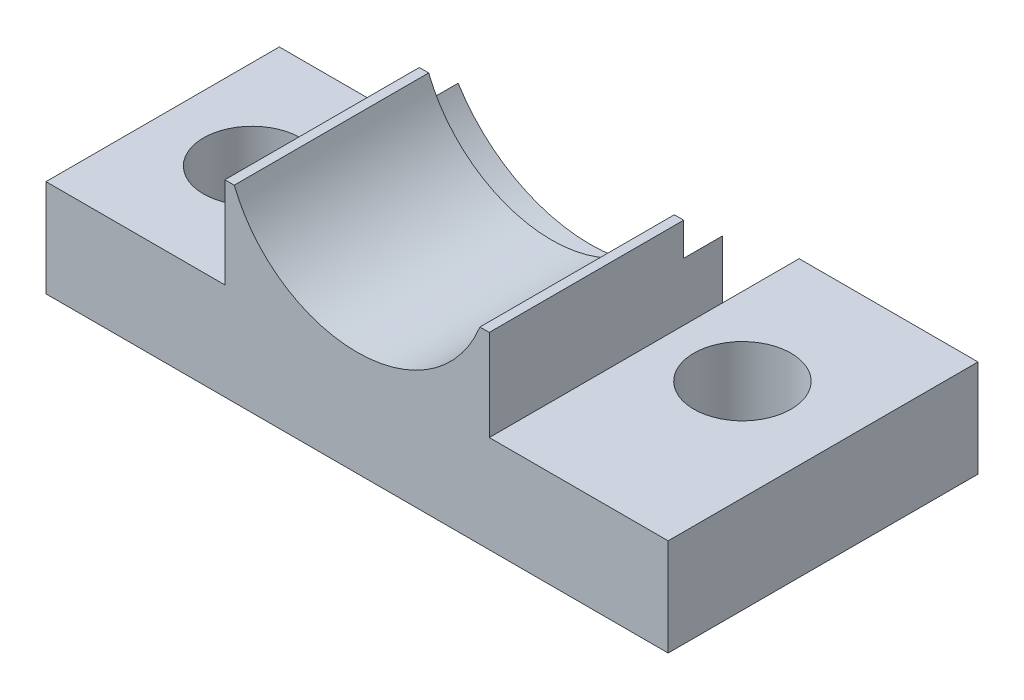
ISO-10303-21;
HEADER;
FILE_DESCRIPTION(('STEP AP214'),'2;1');
FILE_NAME('part.step','',(''),(''),'','','');
FILE_SCHEMA(('AUTOMOTIVE_DESIGN { 1 0 10303 214 1 1 1 1 }'));
ENDSEC;
DATA;
#1=APPLICATION_CONTEXT('core data for automotive mechanical design processes');
#2=APPLICATION_PROTOCOL_DEFINITION('international standard','automotive_design',2000,#1);
#3=PRODUCT_CONTEXT('',#1,'mechanical');
#4=PRODUCT('Part','Part','',(#3));
#5=PRODUCT_RELATED_PRODUCT_CATEGORY('part','',(#4));
#6=PRODUCT_DEFINITION_FORMATION('','',#4);
#7=PRODUCT_DEFINITION_CONTEXT('part definition',#1,'design');
#8=PRODUCT_DEFINITION('design','',#6,#7);
#9=PRODUCT_DEFINITION_SHAPE('','',#8);
#10=(LENGTH_UNIT() NAMED_UNIT(*) SI_UNIT(.MILLI.,.METRE.));
#11=(NAMED_UNIT(*) PLANE_ANGLE_UNIT() SI_UNIT($,.RADIAN.));
#12=(NAMED_UNIT(*) SI_UNIT($,.STERADIAN.) SOLID_ANGLE_UNIT());
#13=UNCERTAINTY_MEASURE_WITH_UNIT(LENGTH_MEASURE(1.E-05),#10,'distance_accuracy_value','');
#14=(GEOMETRIC_REPRESENTATION_CONTEXT(3) GLOBAL_UNCERTAINTY_ASSIGNED_CONTEXT((#13)) GLOBAL_UNIT_ASSIGNED_CONTEXT((#10,
#11,#12)) REPRESENTATION_CONTEXT('',''));
#15=CARTESIAN_POINT('',(0.,0.,0.));
#16=DIRECTION('',(0.,0.,1.));
#17=DIRECTION('',(1.,0.,0.));
#18=AXIS2_PLACEMENT_3D('',#15,#16,#17);
#19=CARTESIAN_POINT('',(-10.16,0.,3.81));
#20=DIRECTION('',(0.,1.,0.));
#21=DIRECTION('',(0.,0.,1.));
#22=AXIS2_PLACEMENT_3D('',#19,#20,#21);
#23=PLANE('',#22);
#24=DIRECTION('',(0.,0.,-1.));
#25=VECTOR('',#24,1.);
#26=CARTESIAN_POINT('',(0.,0.,7.62));
#27=LINE('',#26,#25);
#28=CARTESIAN_POINT('',(0.,0.,7.62));
#29=VERTEX_POINT('',#28);
#30=CARTESIAN_POINT('',(0.,0.,-2.5));
#31=VERTEX_POINT('',#30);
#32=EDGE_CURVE('E143',#29,#31,#27,.T.);
#33=ORIENTED_EDGE('',*,*,#32,.F.);
#34=DIRECTION('',(1.,0.,0.));
#35=VECTOR('',#34,1.);
#36=CARTESIAN_POINT('',(-20.32,0.,7.62));
#37=LINE('',#36,#35);
#38=CARTESIAN_POINT('',(-20.32,0.,7.62));
#39=VERTEX_POINT('',#38);
#40=EDGE_CURVE('E198',#39,#29,#37,.T.);
#41=ORIENTED_EDGE('',*,*,#40,.F.);
#42=DIRECTION('',(0.,0.,1.));
#43=VECTOR('',#42,1.);
#44=CARTESIAN_POINT('',(-20.32,0.,0.));
#45=LINE('',#44,#43);
#46=CARTESIAN_POINT('',(-20.32,0.,0.));
#47=VERTEX_POINT('',#46);
#48=EDGE_CURVE('E169',#47,#39,#45,.T.);
#49=ORIENTED_EDGE('',*,*,#48,.F.);
#50=DIRECTION('',(-1.,0.,0.));
#51=VECTOR('',#50,1.);
#52=CARTESIAN_POINT('',(0.,0.,0.));
#53=LINE('',#52,#51);
#54=CARTESIAN_POINT('',(-5.842,0.,0.));
#55=VERTEX_POINT('',#54);
#56=EDGE_CURVE('E10',#55,#47,#53,.T.);
#57=ORIENTED_EDGE('',*,*,#56,.F.);
#58=DIRECTION('',(0.,0.,-1.));
#59=VECTOR('',#58,1.);
#60=CARTESIAN_POINT('',(-5.842,0.,0.));
#61=LINE('',#60,#59);
#62=CARTESIAN_POINT('',(-5.842,0.,-2.5));
#63=VERTEX_POINT('',#62);
#64=EDGE_CURVE('E133',#55,#63,#61,.T.);
#65=ORIENTED_EDGE('',*,*,#64,.T.);
#66=DIRECTION('',(-1.,0.,0.));
#67=VECTOR('',#66,1.);
#68=CARTESIAN_POINT('',(0.,0.,-2.5));
#69=LINE('',#68,#67);
#70=EDGE_CURVE('E111',#31,#63,#69,.T.);
#71=ORIENTED_EDGE('',*,*,#70,.F.);
#72=EDGE_LOOP('',(#33,#41,#49,#57,#65,#71));
#73=FACE_BOUND('',#72,.T.);
#74=CARTESIAN_POINT('',(-3.302,0.,1.8923));
#75=DIRECTION('',(0.,1.,0.));
#76=DIRECTION('',(-1.,0.,0.));
#77=AXIS2_PLACEMENT_3D('',#74,#75,#76);
#78=CIRCLE('',#77,1.5875);
#79=CARTESIAN_POINT('',(-1.7145,0.,1.8923));
#80=VERTEX_POINT('',#79);
#81=EDGE_CURVE('E156',#80,#80,#78,.T.);
#82=ORIENTED_EDGE('',*,*,#81,.T.);
#83=EDGE_LOOP('',(#82));
#84=FACE_BOUND('',#83,.T.);
#85=CARTESIAN_POINT('',(-17.399,0.,3.81));
#86=DIRECTION('',(0.,1.,0.));
#87=DIRECTION('',(-1.,0.,0.));
#88=AXIS2_PLACEMENT_3D('',#85,#86,#87);
#89=CIRCLE('',#88,1.5875);
#90=CARTESIAN_POINT('',(-15.8115,0.,3.81));
#91=VERTEX_POINT('',#90);
#92=EDGE_CURVE('E110',#91,#91,#89,.T.);
#93=ORIENTED_EDGE('',*,*,#92,.T.);
#94=EDGE_LOOP('',(#93));
#95=FACE_BOUND('',#94,.T.);
#96=ADVANCED_FACE('F15',(#73,#84,#95),#23,.F.);
#97=CARTESIAN_POINT('',(0.,0.,0.));
#98=DIRECTION('',(0.,0.,-1.));
#99=DIRECTION('',(-1.,0.,0.));
#100=AXIS2_PLACEMENT_3D('',#97,#98,#99);
#101=PLANE('',#100);
#102=DIRECTION('',(0.,-1.,0.));
#103=VECTOR('',#102,1.);
#104=CARTESIAN_POINT('',(-5.842,0.,0.));
#105=LINE('',#104,#103);
#106=CARTESIAN_POINT('',(-5.842,3.175,0.));
#107=VERTEX_POINT('',#106);
#108=EDGE_CURVE('E159',#107,#55,#105,.T.);
#109=ORIENTED_EDGE('',*,*,#108,.T.);
#110=ORIENTED_EDGE('',*,*,#56,.T.);
#111=DIRECTION('',(0.,1.,0.));
#112=VECTOR('',#111,1.);
#113=CARTESIAN_POINT('',(-20.32,0.,0.));
#114=LINE('',#113,#112);
#115=CARTESIAN_POINT('',(-20.32,3.175,0.));
#116=VERTEX_POINT('',#115);
#117=EDGE_CURVE('E26',#47,#116,#114,.T.);
#118=ORIENTED_EDGE('',*,*,#117,.T.);
#119=DIRECTION('',(-1.,0.,0.));
#120=VECTOR('',#119,1.);
#121=CARTESIAN_POINT('',(0.,3.175,0.));
#122=LINE('',#121,#120);
#123=CARTESIAN_POINT('',(-14.478,3.175,0.));
#124=VERTEX_POINT('',#123);
#125=EDGE_CURVE('E144',#124,#116,#122,.T.);
#126=ORIENTED_EDGE('',*,*,#125,.F.);
#127=DIRECTION('',(0.,1.,0.));
#128=VECTOR('',#127,1.);
#129=CARTESIAN_POINT('',(-14.478,3.175,0.));
#130=LINE('',#129,#128);
#131=CARTESIAN_POINT('',(-14.478,5.07094394677542,0.));
#132=VERTEX_POINT('',#131);
#133=EDGE_CURVE('E154',#124,#132,#130,.T.);
#134=ORIENTED_EDGE('',*,*,#133,.T.);
#135=CARTESIAN_POINT('',(-10.16,7.747,0.));
#136=DIRECTION('',(0.,0.,1.));
#137=DIRECTION('',(1.,0.,0.));
#138=AXIS2_PLACEMENT_3D('',#135,#136,#137);
#139=CIRCLE('',#138,5.08);
#140=CARTESIAN_POINT('',(-5.842,5.0709439467754,0.));
#141=VERTEX_POINT('',#140);
#142=EDGE_CURVE('E149',#132,#141,#139,.T.);
#143=ORIENTED_EDGE('',*,*,#142,.T.);
#144=DIRECTION('',(0.,1.,0.));
#145=VECTOR('',#144,1.);
#146=CARTESIAN_POINT('',(-5.842,3.175,0.));
#147=LINE('',#146,#145);
#148=EDGE_CURVE('E137',#107,#141,#147,.T.);
#149=ORIENTED_EDGE('',*,*,#148,.F.);
#150=EDGE_LOOP('',(#109,#110,#118,#126,#134,#143,#149));
#151=FACE_BOUND('',#150,.T.);
#152=ADVANCED_FACE('F333',(#151),#101,.T.);
#153=CARTESIAN_POINT('',(-20.32,0.,0.));
#154=DIRECTION('',(-1.,0.,0.));
#155=DIRECTION('',(0.,0.,1.));
#156=AXIS2_PLACEMENT_3D('',#153,#154,#155);
#157=PLANE('',#156);
#158=ORIENTED_EDGE('',*,*,#48,.T.);
#159=DIRECTION('',(0.,1.,0.));
#160=VECTOR('',#159,1.);
#161=CARTESIAN_POINT('',(-20.32,0.,7.62));
#162=LINE('',#161,#160);
#163=CARTESIAN_POINT('',(-20.32,3.175,7.62));
#164=VERTEX_POINT('',#163);
#165=EDGE_CURVE('E19',#39,#164,#162,.T.);
#166=ORIENTED_EDGE('',*,*,#165,.T.);
#167=DIRECTION('',(0.,0.,1.));
#168=VECTOR('',#167,1.);
#169=CARTESIAN_POINT('',(-20.32,3.175,0.));
#170=LINE('',#169,#168);
#171=EDGE_CURVE('E140',#116,#164,#170,.T.);
#172=ORIENTED_EDGE('',*,*,#171,.F.);
#173=ORIENTED_EDGE('',*,*,#117,.F.);
#174=EDGE_LOOP('',(#158,#166,#172,#173));
#175=FACE_BOUND('',#174,.T.);
#176=ADVANCED_FACE('F256',(#175),#157,.T.);
#177=CARTESIAN_POINT('',(0.,0.,7.62));
#178=DIRECTION('',(1.,0.,0.));
#179=DIRECTION('',(0.,0.,-1.));
#180=AXIS2_PLACEMENT_3D('',#177,#178,#179);
#181=PLANE('',#180);
#182=ORIENTED_EDGE('',*,*,#32,.T.);
#183=DIRECTION('',(0.,-1.,0.));
#184=VECTOR('',#183,1.);
#185=CARTESIAN_POINT('',(0.,3.175,-2.5));
#186=LINE('',#185,#184);
#187=CARTESIAN_POINT('',(0.,3.175,-2.5));
#188=VERTEX_POINT('',#187);
#189=EDGE_CURVE('E117',#188,#31,#186,.T.);
#190=ORIENTED_EDGE('',*,*,#189,.F.);
#191=DIRECTION('',(0.,0.,-1.));
#192=VECTOR('',#191,1.);
#193=CARTESIAN_POINT('',(0.,3.175,7.62));
#194=LINE('',#193,#192);
#195=CARTESIAN_POINT('',(0.,3.175,7.62));
#196=VERTEX_POINT('',#195);
#197=EDGE_CURVE('E177',#196,#188,#194,.T.);
#198=ORIENTED_EDGE('',*,*,#197,.F.);
#199=DIRECTION('',(0.,1.,0.));
#200=VECTOR('',#199,1.);
#201=CARTESIAN_POINT('',(0.,0.,7.62));
#202=LINE('',#201,#200);
#203=EDGE_CURVE('E202',#29,#196,#202,.T.);
#204=ORIENTED_EDGE('',*,*,#203,.F.);
#205=EDGE_LOOP('',(#182,#190,#198,#204));
#206=FACE_BOUND('',#205,.T.);
#207=ADVANCED_FACE('F310',(#206),#181,.T.);
#208=CARTESIAN_POINT('',(-10.16,3.175,3.81));
#209=DIRECTION('',(0.,1.,0.));
#210=DIRECTION('',(0.,0.,1.));
#211=AXIS2_PLACEMENT_3D('',#208,#209,#210);
#212=PLANE('',#211);
#213=DIRECTION('',(0.,0.,-1.));
#214=VECTOR('',#213,1.);
#215=CARTESIAN_POINT('',(-14.478,3.175,1.905));
#216=LINE('',#215,#214);
#217=CARTESIAN_POINT('',(-14.478,3.175,7.62));
#218=VERTEX_POINT('',#217);
#219=EDGE_CURVE('E150',#218,#124,#216,.T.);
#220=ORIENTED_EDGE('',*,*,#219,.T.);
#221=ORIENTED_EDGE('',*,*,#125,.T.);
#222=ORIENTED_EDGE('',*,*,#171,.T.);
#223=DIRECTION('',(1.,0.,0.));
#224=VECTOR('',#223,1.);
#225=CARTESIAN_POINT('',(-20.32,3.175,7.62));
#226=LINE('',#225,#224);
#227=EDGE_CURVE('E165',#164,#218,#226,.T.);
#228=ORIENTED_EDGE('',*,*,#227,.T.);
#229=EDGE_LOOP('',(#220,#221,#222,#228));
#230=FACE_BOUND('',#229,.T.);
#231=CARTESIAN_POINT('',(-17.399,3.175,3.81));
#232=DIRECTION('',(0.,-1.,0.));
#233=DIRECTION('',(-1.,0.,0.));
#234=AXIS2_PLACEMENT_3D('',#231,#232,#233);
#235=CIRCLE('',#234,1.5875);
#236=CARTESIAN_POINT('',(-15.8115,3.175,3.81));
#237=VERTEX_POINT('',#236);
#238=EDGE_CURVE('E107',#237,#237,#235,.T.);
#239=ORIENTED_EDGE('',*,*,#238,.T.);
#240=EDGE_LOOP('',(#239));
#241=FACE_BOUND('',#240,.T.);
#242=ADVANCED_FACE('F108',(#230,#241),#212,.T.);
#243=CARTESIAN_POINT('',(-10.16,3.175,3.81));
#244=DIRECTION('',(0.,1.,0.));
#245=DIRECTION('',(0.,0.,1.));
#246=AXIS2_PLACEMENT_3D('',#243,#244,#245);
#247=PLANE('',#246);
#248=DIRECTION('',(0.,0.,1.));
#249=VECTOR('',#248,1.);
#250=CARTESIAN_POINT('',(-5.842,3.175,5.715));
#251=LINE('',#250,#249);
#252=CARTESIAN_POINT('',(-5.842,3.175,7.62));
#253=VERTEX_POINT('',#252);
#254=EDGE_CURVE('E135',#107,#253,#251,.T.);
#255=ORIENTED_EDGE('',*,*,#254,.T.);
#256=DIRECTION('',(1.,0.,0.));
#257=VECTOR('',#256,1.);
#258=CARTESIAN_POINT('',(-20.32,3.175,7.62));
#259=LINE('',#258,#257);
#260=EDGE_CURVE('E121',#253,#196,#259,.T.);
#261=ORIENTED_EDGE('',*,*,#260,.T.);
#262=ORIENTED_EDGE('',*,*,#197,.T.);
#263=DIRECTION('',(1.,0.,0.));
#264=VECTOR('',#263,1.);
#265=CARTESIAN_POINT('',(-5.842,3.175,-2.5));
#266=LINE('',#265,#264);
#267=CARTESIAN_POINT('',(-5.842,3.175,-2.5));
#268=VERTEX_POINT('',#267);
#269=EDGE_CURVE('E176',#268,#188,#266,.T.);
#270=ORIENTED_EDGE('',*,*,#269,.F.);
#271=DIRECTION('',(0.,0.,-1.));
#272=VECTOR('',#271,1.);
#273=CARTESIAN_POINT('',(-5.842,3.175,0.));
#274=LINE('',#273,#272);
#275=EDGE_CURVE('E134',#107,#268,#274,.T.);
#276=ORIENTED_EDGE('',*,*,#275,.F.);
#277=EDGE_LOOP('',(#255,#261,#262,#270,#276));
#278=FACE_BOUND('',#277,.T.);
#279=CARTESIAN_POINT('',(-3.302,3.175,1.8923));
#280=DIRECTION('',(0.,-1.,0.));
#281=DIRECTION('',(-1.,0.,0.));
#282=AXIS2_PLACEMENT_3D('',#279,#280,#281);
#283=CIRCLE('',#282,1.5875);
#284=CARTESIAN_POINT('',(-1.7145,3.175,1.8923));
#285=VERTEX_POINT('',#284);
#286=EDGE_CURVE('E113',#285,#285,#283,.T.);
#287=ORIENTED_EDGE('',*,*,#286,.T.);
#288=EDGE_LOOP('',(#287));
#289=FACE_BOUND('',#288,.T.);
#290=ADVANCED_FACE('F309',(#278,#289),#247,.T.);
#291=CARTESIAN_POINT('',(-20.32,0.,7.62));
#292=DIRECTION('',(0.,0.,1.));
#293=DIRECTION('',(1.,0.,0.));
#294=AXIS2_PLACEMENT_3D('',#291,#292,#293);
#295=PLANE('',#294);
#296=DIRECTION('',(-1.,0.,0.));
#297=VECTOR('',#296,1.);
#298=CARTESIAN_POINT('',(-13.081,6.14917574170766,7.62));
#299=LINE('',#298,#297);
#300=CARTESIAN_POINT('',(-5.842,6.14917574170766,7.62));
#301=VERTEX_POINT('',#300);
#302=CARTESIAN_POINT('',(-6.14850630816742,6.14917574170766,7.62));
#303=VERTEX_POINT('',#302);
#304=EDGE_CURVE('E184',#301,#303,#299,.T.);
#305=ORIENTED_EDGE('',*,*,#304,.T.);
#306=CARTESIAN_POINT('',(-10.16,7.747,7.62));
#307=DIRECTION('',(0.,0.,-1.));
#308=DIRECTION('',(-1.,0.,0.));
#309=AXIS2_PLACEMENT_3D('',#306,#307,#308);
#310=CIRCLE('',#309,4.318);
#311=CARTESIAN_POINT('',(-14.1714936918326,6.14917574170766,7.62));
#312=VERTEX_POINT('',#311);
#313=EDGE_CURVE('E208',#303,#312,#310,.T.);
#314=ORIENTED_EDGE('',*,*,#313,.T.);
#315=DIRECTION('',(-1.,0.,0.));
#316=VECTOR('',#315,1.);
#317=CARTESIAN_POINT('',(-13.081,6.14917574170766,7.62));
#318=LINE('',#317,#316);
#319=CARTESIAN_POINT('',(-14.478,6.14917574170766,7.62));
#320=VERTEX_POINT('',#319);
#321=EDGE_CURVE('E190',#312,#320,#318,.T.);
#322=ORIENTED_EDGE('',*,*,#321,.T.);
#323=DIRECTION('',(0.,1.,0.));
#324=VECTOR('',#323,1.);
#325=CARTESIAN_POINT('',(-14.478,3.175,7.62));
#326=LINE('',#325,#324);
#327=EDGE_CURVE('E153',#218,#320,#326,.T.);
#328=ORIENTED_EDGE('',*,*,#327,.F.);
#329=ORIENTED_EDGE('',*,*,#227,.F.);
#330=ORIENTED_EDGE('',*,*,#165,.F.);
#331=ORIENTED_EDGE('',*,*,#40,.T.);
#332=ORIENTED_EDGE('',*,*,#203,.T.);
#333=ORIENTED_EDGE('',*,*,#260,.F.);
#334=DIRECTION('',(0.,1.,0.));
#335=VECTOR('',#334,1.);
#336=CARTESIAN_POINT('',(-5.842,3.175,7.62));
#337=LINE('',#336,#335);
#338=EDGE_CURVE('E138',#253,#301,#337,.T.);
#339=ORIENTED_EDGE('',*,*,#338,.T.);
#340=EDGE_LOOP('',(#305,#314,#322,#328,#329,#330,#331,#332,#333,#339));
#341=FACE_BOUND('',#340,.T.);
#342=ADVANCED_FACE('F268',(#341),#295,.T.);
#343=CARTESIAN_POINT('',(-5.842,3.175,7.62));
#344=DIRECTION('',(1.,0.,0.));
#345=DIRECTION('',(0.,0.,-1.));
#346=AXIS2_PLACEMENT_3D('',#343,#344,#345);
#347=PLANE('',#346);
#348=DIRECTION('',(0.,1.,0.));
#349=VECTOR('',#348,1.);
#350=CARTESIAN_POINT('',(-5.842,5.461,1.27));
#351=LINE('',#350,#349);
#352=CARTESIAN_POINT('',(-5.842,5.0709439467754,1.27));
#353=VERTEX_POINT('',#352);
#354=CARTESIAN_POINT('',(-5.842,6.14917574170766,1.27));
#355=VERTEX_POINT('',#354);
#356=EDGE_CURVE('E128',#353,#355,#351,.T.);
#357=ORIENTED_EDGE('',*,*,#356,.T.);
#358=DIRECTION('',(0.,0.,1.));
#359=VECTOR('',#358,1.);
#360=CARTESIAN_POINT('',(-5.842,6.14917574170766,7.62));
#361=LINE('',#360,#359);
#362=EDGE_CURVE('E195',#355,#301,#361,.T.);
#363=ORIENTED_EDGE('',*,*,#362,.T.);
#364=ORIENTED_EDGE('',*,*,#338,.F.);
#365=ORIENTED_EDGE('',*,*,#254,.F.);
#366=ORIENTED_EDGE('',*,*,#148,.T.);
#367=DIRECTION('',(0.,0.,1.));
#368=VECTOR('',#367,1.);
#369=CARTESIAN_POINT('',(-5.842,5.0709439467754,0.));
#370=LINE('',#369,#368);
#371=EDGE_CURVE('E172',#141,#353,#370,.T.);
#372=ORIENTED_EDGE('',*,*,#371,.T.);
#373=EDGE_LOOP('',(#357,#363,#364,#365,#366,#372));
#374=FACE_BOUND('',#373,.T.);
#375=ADVANCED_FACE('F17',(#374),#347,.T.);
#376=CARTESIAN_POINT('',(-5.842,6.14917574170766,7.62));
#377=DIRECTION('',(0.,-1.,0.));
#378=DIRECTION('',(-1.,0.,0.));
#379=AXIS2_PLACEMENT_3D('',#376,#377,#378);
#380=PLANE('',#379);
#381=DIRECTION('',(-1.,0.,0.));
#382=VECTOR('',#381,1.);
#383=CARTESIAN_POINT('',(-8.001,6.14917574170766,1.27));
#384=LINE('',#383,#382);
#385=CARTESIAN_POINT('',(-6.14850630816742,6.14917574170766,1.27));
#386=VERTEX_POINT('',#385);
#387=EDGE_CURVE('E203',#355,#386,#384,.T.);
#388=ORIENTED_EDGE('',*,*,#387,.T.);
#389=DIRECTION('',(0.,0.,-1.));
#390=VECTOR('',#389,1.);
#391=CARTESIAN_POINT('',(-6.14850630816742,6.14917574170766,7.62));
#392=LINE('',#391,#390);
#393=EDGE_CURVE('E191',#303,#386,#392,.T.);
#394=ORIENTED_EDGE('',*,*,#393,.F.);
#395=ORIENTED_EDGE('',*,*,#304,.F.);
#396=ORIENTED_EDGE('',*,*,#362,.F.);
#397=EDGE_LOOP('',(#388,#394,#395,#396));
#398=FACE_BOUND('',#397,.T.);
#399=ADVANCED_FACE('F359',(#398),#380,.F.);
#400=CARTESIAN_POINT('',(-14.478,3.175,0.));
#401=DIRECTION('',(-1.,0.,0.));
#402=DIRECTION('',(0.,0.,1.));
#403=AXIS2_PLACEMENT_3D('',#400,#401,#402);
#404=PLANE('',#403);
#405=DIRECTION('',(0.,-1.,0.));
#406=VECTOR('',#405,1.);
#407=CARTESIAN_POINT('',(-14.478,5.461,1.27));
#408=LINE('',#407,#406);
#409=CARTESIAN_POINT('',(-14.478,6.14917574170766,1.27));
#410=VERTEX_POINT('',#409);
#411=CARTESIAN_POINT('',(-14.478,5.07094394677542,1.27));
#412=VERTEX_POINT('',#411);
#413=EDGE_CURVE('E127',#410,#412,#408,.T.);
#414=ORIENTED_EDGE('',*,*,#413,.T.);
#415=DIRECTION('',(0.,0.,-1.));
#416=VECTOR('',#415,1.);
#417=CARTESIAN_POINT('',(-14.478,5.07094394677542,0.));
#418=LINE('',#417,#416);
#419=EDGE_CURVE('E145',#412,#132,#418,.T.);
#420=ORIENTED_EDGE('',*,*,#419,.T.);
#421=ORIENTED_EDGE('',*,*,#133,.F.);
#422=ORIENTED_EDGE('',*,*,#219,.F.);
#423=ORIENTED_EDGE('',*,*,#327,.T.);
#424=DIRECTION('',(0.,0.,-1.));
#425=VECTOR('',#424,1.);
#426=CARTESIAN_POINT('',(-14.478,6.14917574170766,3.81));
#427=LINE('',#426,#425);
#428=EDGE_CURVE('E188',#320,#410,#427,.T.);
#429=ORIENTED_EDGE('',*,*,#428,.T.);
#430=EDGE_LOOP('',(#414,#420,#421,#422,#423,#429));
#431=FACE_BOUND('',#430,.T.);
#432=ADVANCED_FACE('F364',(#431),#404,.T.);
#433=CARTESIAN_POINT('',(-5.842,6.14917574170766,7.62));
#434=DIRECTION('',(0.,-1.,0.));
#435=DIRECTION('',(-1.,0.,0.));
#436=AXIS2_PLACEMENT_3D('',#433,#434,#435);
#437=PLANE('',#436);
#438=DIRECTION('',(-1.,0.,0.));
#439=VECTOR('',#438,1.);
#440=CARTESIAN_POINT('',(-8.001,6.14917574170766,1.27));
#441=LINE('',#440,#439);
#442=CARTESIAN_POINT('',(-14.1714936918326,6.14917574170766,1.27));
#443=VERTEX_POINT('',#442);
#444=EDGE_CURVE('E161',#443,#410,#441,.T.);
#445=ORIENTED_EDGE('',*,*,#444,.T.);
#446=ORIENTED_EDGE('',*,*,#428,.F.);
#447=ORIENTED_EDGE('',*,*,#321,.F.);
#448=DIRECTION('',(0.,0.,1.));
#449=VECTOR('',#448,1.);
#450=CARTESIAN_POINT('',(-14.1714936918326,6.14917574170766,7.62));
#451=LINE('',#450,#449);
#452=EDGE_CURVE('E148',#443,#312,#451,.T.);
#453=ORIENTED_EDGE('',*,*,#452,.F.);
#454=EDGE_LOOP('',(#445,#446,#447,#453));
#455=FACE_BOUND('',#454,.T.);
#456=ADVANCED_FACE('F408',(#455),#437,.F.);
#457=CARTESIAN_POINT('',(-10.16,7.747,7.62));
#458=DIRECTION('',(0.,0.,1.));
#459=DIRECTION('',(-1.,0.,0.));
#460=AXIS2_PLACEMENT_3D('',#457,#458,#459);
#461=CYLINDRICAL_SURFACE('',#460,4.318);
#462=CARTESIAN_POINT('',(-10.16,7.747,1.27));
#463=DIRECTION('',(0.,0.,-1.));
#464=DIRECTION('',(-1.,0.,0.));
#465=AXIS2_PLACEMENT_3D('',#462,#463,#464);
#466=CIRCLE('',#465,4.318);
#467=EDGE_CURVE('E164',#386,#443,#466,.T.);
#468=ORIENTED_EDGE('',*,*,#467,.T.);
#469=ORIENTED_EDGE('',*,*,#452,.T.);
#470=ORIENTED_EDGE('',*,*,#313,.F.);
#471=ORIENTED_EDGE('',*,*,#393,.T.);
#472=EDGE_LOOP('',(#468,#469,#470,#471));
#473=FACE_BOUND('',#472,.T.);
#474=ADVANCED_FACE('F343',(#473),#461,.F.);
#475=CARTESIAN_POINT('',(-10.16,7.747,0.));
#476=DIRECTION('',(0.,0.,-1.));
#477=DIRECTION('',(1.,0.,0.));
#478=AXIS2_PLACEMENT_3D('',#475,#476,#477);
#479=CYLINDRICAL_SURFACE('',#478,5.08);
#480=ORIENTED_EDGE('',*,*,#371,.F.);
#481=ORIENTED_EDGE('',*,*,#142,.F.);
#482=ORIENTED_EDGE('',*,*,#419,.F.);
#483=CARTESIAN_POINT('',(-10.16,7.747,1.27));
#484=DIRECTION('',(0.,0.,1.));
#485=DIRECTION('',(1.,0.,0.));
#486=AXIS2_PLACEMENT_3D('',#483,#484,#485);
#487=CIRCLE('',#486,5.08);
#488=EDGE_CURVE('E123',#412,#353,#487,.T.);
#489=ORIENTED_EDGE('',*,*,#488,.T.);
#490=EDGE_LOOP('',(#480,#481,#482,#489));
#491=FACE_BOUND('',#490,.T.);
#492=ADVANCED_FACE('F220',(#491),#479,.F.);
#493=CARTESIAN_POINT('',(-10.16,7.747,1.27));
#494=DIRECTION('',(0.,0.,1.));
#495=DIRECTION('',(1.,0.,0.));
#496=AXIS2_PLACEMENT_3D('',#493,#494,#495);
#497=PLANE('',#496);
#498=ORIENTED_EDGE('',*,*,#356,.F.);
#499=ORIENTED_EDGE('',*,*,#488,.F.);
#500=ORIENTED_EDGE('',*,*,#413,.F.);
#501=ORIENTED_EDGE('',*,*,#444,.F.);
#502=ORIENTED_EDGE('',*,*,#467,.F.);
#503=ORIENTED_EDGE('',*,*,#387,.F.);
#504=EDGE_LOOP('',(#498,#499,#500,#501,#502,#503));
#505=FACE_BOUND('',#504,.T.);
#506=ADVANCED_FACE('F225',(#505),#497,.F.);
#507=CARTESIAN_POINT('',(-3.302,0.,1.8923));
#508=DIRECTION('',(0.,-1.,0.));
#509=DIRECTION('',(-1.,0.,0.));
#510=AXIS2_PLACEMENT_3D('',#507,#508,#509);
#511=CYLINDRICAL_SURFACE('',#510,1.5875);
#512=ORIENTED_EDGE('',*,*,#81,.F.);
#513=EDGE_LOOP('',(#512));
#514=FACE_BOUND('',#513,.T.);
#515=ORIENTED_EDGE('',*,*,#286,.F.);
#516=EDGE_LOOP('',(#515));
#517=FACE_BOUND('',#516,.T.);
#518=ADVANCED_FACE('F297',(#514,#517),#511,.F.);
#519=CARTESIAN_POINT('',(-17.399,0.,3.81));
#520=DIRECTION('',(0.,-1.,0.));
#521=DIRECTION('',(-1.,0.,0.));
#522=AXIS2_PLACEMENT_3D('',#519,#520,#521);
#523=CYLINDRICAL_SURFACE('',#522,1.5875);
#524=ORIENTED_EDGE('',*,*,#92,.F.);
#525=EDGE_LOOP('',(#524));
#526=FACE_BOUND('',#525,.T.);
#527=ORIENTED_EDGE('',*,*,#238,.F.);
#528=EDGE_LOOP('',(#527));
#529=FACE_BOUND('',#528,.T.);
#530=ADVANCED_FACE('F283',(#526,#529),#523,.F.);
#531=CARTESIAN_POINT('',(-2.921,1.5875,-2.5));
#532=DIRECTION('',(0.,0.,1.));
#533=DIRECTION('',(1.,0.,0.));
#534=AXIS2_PLACEMENT_3D('',#531,#532,#533);
#535=PLANE('',#534);
#536=ORIENTED_EDGE('',*,*,#269,.T.);
#537=ORIENTED_EDGE('',*,*,#189,.T.);
#538=ORIENTED_EDGE('',*,*,#70,.T.);
#539=DIRECTION('',(0.,1.,0.));
#540=VECTOR('',#539,1.);
#541=CARTESIAN_POINT('',(-5.842,0.,-2.5));
#542=LINE('',#541,#540);
#543=EDGE_CURVE('E129',#63,#268,#542,.T.);
#544=ORIENTED_EDGE('',*,*,#543,.T.);
#545=EDGE_LOOP('',(#536,#537,#538,#544));
#546=FACE_BOUND('',#545,.T.);
#547=ADVANCED_FACE('F276',(#546),#535,.F.);
#548=CARTESIAN_POINT('',(-5.842,0.,0.));
#549=DIRECTION('',(-1.,0.,0.));
#550=DIRECTION('',(0.,1.,0.));
#551=AXIS2_PLACEMENT_3D('',#548,#549,#550);
#552=PLANE('',#551);
#553=ORIENTED_EDGE('',*,*,#108,.F.);
#554=ORIENTED_EDGE('',*,*,#275,.T.);
#555=ORIENTED_EDGE('',*,*,#543,.F.);
#556=ORIENTED_EDGE('',*,*,#64,.F.);
#557=EDGE_LOOP('',(#553,#554,#555,#556));
#558=FACE_BOUND('',#557,.T.);
#559=ADVANCED_FACE('F282',(#558),#552,.T.);
#560=CLOSED_SHELL('',(#96,#152,#176,#207,#242,#290,#342,#375,#399,#432,#456,#474,#492,#506,#518,
#530,#547,#559));
#561=MANIFOLD_SOLID_BREP('B1',#560);
#562=ADVANCED_BREP_SHAPE_REPRESENTATION('',(#18,#561),#14);
#563=SHAPE_DEFINITION_REPRESENTATION(#9,#562);
ENDSEC;
END-ISO-10303-21;
